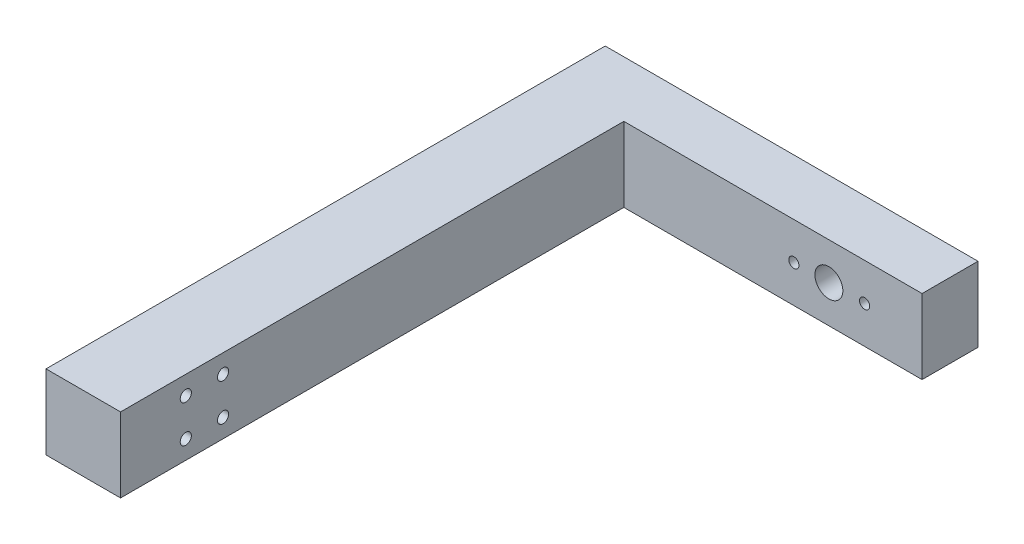
ISO-10303-21;
HEADER;
FILE_DESCRIPTION(('STEP AP214'),'2;1');
FILE_NAME('part.step','',(''),(''),'','','');
FILE_SCHEMA(('AUTOMOTIVE_DESIGN { 1 0 10303 214 1 1 1 1 }'));
ENDSEC;
DATA;
#1=APPLICATION_CONTEXT('core data for automotive mechanical design processes');
#2=APPLICATION_PROTOCOL_DEFINITION('international standard','automotive_design',2000,#1);
#3=PRODUCT_CONTEXT('',#1,'mechanical');
#4=PRODUCT('Part','Part','',(#3));
#5=PRODUCT_RELATED_PRODUCT_CATEGORY('part','',(#4));
#6=PRODUCT_DEFINITION_FORMATION('','',#4);
#7=PRODUCT_DEFINITION_CONTEXT('part definition',#1,'design');
#8=PRODUCT_DEFINITION('design','',#6,#7);
#9=PRODUCT_DEFINITION_SHAPE('','',#8);
#10=(LENGTH_UNIT() NAMED_UNIT(*) SI_UNIT(.MILLI.,.METRE.));
#11=(NAMED_UNIT(*) PLANE_ANGLE_UNIT() SI_UNIT($,.RADIAN.));
#12=(NAMED_UNIT(*) SI_UNIT($,.STERADIAN.) SOLID_ANGLE_UNIT());
#13=UNCERTAINTY_MEASURE_WITH_UNIT(LENGTH_MEASURE(1.E-05),#10,'distance_accuracy_value','');
#14=(GEOMETRIC_REPRESENTATION_CONTEXT(3) GLOBAL_UNCERTAINTY_ASSIGNED_CONTEXT((#13)) GLOBAL_UNIT_ASSIGNED_CONTEXT((#10,
#11,#12)) REPRESENTATION_CONTEXT('',''));
#15=CARTESIAN_POINT('',(0.,0.,0.));
#16=DIRECTION('',(0.,0.,1.));
#17=DIRECTION('',(1.,0.,0.));
#18=AXIS2_PLACEMENT_3D('',#15,#16,#17);
#19=CARTESIAN_POINT('',(-59.7087378640777,40.,79.6601941747573));
#20=DIRECTION('',(1.,0.,0.));
#21=DIRECTION('',(0.,0.,-1.));
#22=AXIS2_PLACEMENT_3D('',#19,#20,#21);
#23=PLANE('',#22);
#24=CARTESIAN_POINT('',(-59.7087378640777,10.,24.6601941747573));
#25=DIRECTION('',(1.,0.,0.));
#26=DIRECTION('',(0.,0.,-1.));
#27=AXIS2_PLACEMENT_3D('',#24,#25,#26);
#28=CIRCLE('',#27,3.);
#29=CARTESIAN_POINT('',(-59.7087378640777,10.,21.6601941747573));
#30=VERTEX_POINT('',#29);
#31=EDGE_CURVE('E184',#30,#30,#28,.T.);
#32=ORIENTED_EDGE('',*,*,#31,.T.);
#33=EDGE_LOOP('',(#32));
#34=FACE_BOUND('',#33,.T.);
#35=CARTESIAN_POINT('',(-59.7087378640777,10.,44.6601941747573));
#36=DIRECTION('',(1.,0.,0.));
#37=DIRECTION('',(0.,0.,-1.));
#38=AXIS2_PLACEMENT_3D('',#35,#36,#37);
#39=CIRCLE('',#38,3.);
#40=CARTESIAN_POINT('',(-59.7087378640777,10.,41.6601941747573));
#41=VERTEX_POINT('',#40);
#42=EDGE_CURVE('E188',#41,#41,#39,.T.);
#43=ORIENTED_EDGE('',*,*,#42,.T.);
#44=EDGE_LOOP('',(#43));
#45=FACE_BOUND('',#44,.T.);
#46=CARTESIAN_POINT('',(-59.7087378640777,30.,44.6601941747573));
#47=DIRECTION('',(1.,0.,0.));
#48=DIRECTION('',(0.,0.,-1.));
#49=AXIS2_PLACEMENT_3D('',#46,#47,#48);
#50=CIRCLE('',#49,3.);
#51=CARTESIAN_POINT('',(-59.7087378640777,30.,41.6601941747573));
#52=VERTEX_POINT('',#51);
#53=EDGE_CURVE('E144',#52,#52,#50,.T.);
#54=ORIENTED_EDGE('',*,*,#53,.T.);
#55=EDGE_LOOP('',(#54));
#56=FACE_BOUND('',#55,.T.);
#57=CARTESIAN_POINT('',(-59.7087378640777,30.,24.6601941747573));
#58=DIRECTION('',(1.,0.,0.));
#59=DIRECTION('',(0.,0.,-1.));
#60=AXIS2_PLACEMENT_3D('',#57,#58,#59);
#61=CIRCLE('',#60,3.);
#62=CARTESIAN_POINT('',(-59.7087378640777,30.,21.6601941747573));
#63=VERTEX_POINT('',#62);
#64=EDGE_CURVE('E136',#63,#63,#61,.T.);
#65=ORIENTED_EDGE('',*,*,#64,.T.);
#66=EDGE_LOOP('',(#65));
#67=FACE_BOUND('',#66,.T.);
#68=DIRECTION('',(0.,0.,1.));
#69=VECTOR('',#68,1.);
#70=CARTESIAN_POINT('',(-59.7087378640777,0.,79.6601941747573));
#71=LINE('',#70,#69);
#72=CARTESIAN_POINT('',(-59.7087378640777,0.,-220.339805825243));
#73=VERTEX_POINT('',#72);
#74=CARTESIAN_POINT('',(-59.7087378640777,0.,79.6601941747573));
#75=VERTEX_POINT('',#74);
#76=EDGE_CURVE('E119',#73,#75,#71,.T.);
#77=ORIENTED_EDGE('',*,*,#76,.T.);
#78=DIRECTION('',(0.,-1.,0.));
#79=VECTOR('',#78,1.);
#80=CARTESIAN_POINT('',(-59.7087378640777,40.,79.6601941747573));
#81=LINE('',#80,#79);
#82=CARTESIAN_POINT('',(-59.7087378640777,40.,79.6601941747573));
#83=VERTEX_POINT('',#82);
#84=EDGE_CURVE('E11',#83,#75,#81,.T.);
#85=ORIENTED_EDGE('',*,*,#84,.F.);
#86=DIRECTION('',(0.,0.,1.));
#87=VECTOR('',#86,1.);
#88=CARTESIAN_POINT('',(-59.7087378640777,40.,79.6601941747573));
#89=LINE('',#88,#87);
#90=CARTESIAN_POINT('',(-59.7087378640777,40.,-220.339805825243));
#91=VERTEX_POINT('',#90);
#92=EDGE_CURVE('E130',#91,#83,#89,.T.);
#93=ORIENTED_EDGE('',*,*,#92,.F.);
#94=DIRECTION('',(0.,-1.,0.));
#95=VECTOR('',#94,1.);
#96=CARTESIAN_POINT('',(-59.7087378640777,40.,-220.339805825243));
#97=LINE('',#96,#95);
#98=EDGE_CURVE('E115',#91,#73,#97,.T.);
#99=ORIENTED_EDGE('',*,*,#98,.T.);
#100=EDGE_LOOP('',(#77,#85,#93,#99));
#101=FACE_BOUND('',#100,.T.);
#102=ADVANCED_FACE('F33',(#34,#45,#56,#67,#101),#23,.F.);
#103=CARTESIAN_POINT('',(-19.7087378640777,40.,79.6601941747573));
#104=DIRECTION('',(0.,0.,-1.));
#105=DIRECTION('',(-1.,0.,0.));
#106=AXIS2_PLACEMENT_3D('',#103,#104,#105);
#107=PLANE('',#106);
#108=DIRECTION('',(1.,0.,0.));
#109=VECTOR('',#108,1.);
#110=CARTESIAN_POINT('',(-19.7087378640777,0.,79.6601941747573));
#111=LINE('',#110,#109);
#112=CARTESIAN_POINT('',(-19.7087378640777,0.,79.6601941747573));
#113=VERTEX_POINT('',#112);
#114=EDGE_CURVE('E122',#75,#113,#111,.T.);
#115=ORIENTED_EDGE('',*,*,#114,.T.);
#116=DIRECTION('',(0.,-1.,0.));
#117=VECTOR('',#116,1.);
#118=CARTESIAN_POINT('',(-19.7087378640777,40.,79.6601941747573));
#119=LINE('',#118,#117);
#120=CARTESIAN_POINT('',(-19.7087378640777,40.,79.6601941747573));
#121=VERTEX_POINT('',#120);
#122=EDGE_CURVE('E42',#121,#113,#119,.T.);
#123=ORIENTED_EDGE('',*,*,#122,.F.);
#124=DIRECTION('',(1.,0.,0.));
#125=VECTOR('',#124,1.);
#126=CARTESIAN_POINT('',(-19.7087378640777,40.,79.6601941747573));
#127=LINE('',#126,#125);
#128=EDGE_CURVE('E88',#83,#121,#127,.T.);
#129=ORIENTED_EDGE('',*,*,#128,.F.);
#130=ORIENTED_EDGE('',*,*,#84,.T.);
#131=EDGE_LOOP('',(#115,#123,#129,#130));
#132=FACE_BOUND('',#131,.T.);
#133=ADVANCED_FACE('F151',(#132),#107,.F.);
#134=CARTESIAN_POINT('',(-19.7087378640777,40.,-190.339805825243));
#135=DIRECTION('',(-1.,0.,0.));
#136=DIRECTION('',(0.,0.,1.));
#137=AXIS2_PLACEMENT_3D('',#134,#135,#136);
#138=PLANE('',#137);
#139=CARTESIAN_POINT('',(-19.7087378640777,10.,24.6601941747573));
#140=DIRECTION('',(1.,0.,0.));
#141=DIRECTION('',(0.,0.,-1.));
#142=AXIS2_PLACEMENT_3D('',#139,#140,#141);
#143=CIRCLE('',#142,3.);
#144=CARTESIAN_POINT('',(-19.7087378640777,10.,21.6601941747573));
#145=VERTEX_POINT('',#144);
#146=EDGE_CURVE('E196',#145,#145,#143,.T.);
#147=ORIENTED_EDGE('',*,*,#146,.F.);
#148=EDGE_LOOP('',(#147));
#149=FACE_BOUND('',#148,.T.);
#150=CARTESIAN_POINT('',(-19.7087378640777,10.,44.6601941747573));
#151=DIRECTION('',(1.,0.,0.));
#152=DIRECTION('',(0.,0.,-1.));
#153=AXIS2_PLACEMENT_3D('',#150,#151,#152);
#154=CIRCLE('',#153,3.);
#155=CARTESIAN_POINT('',(-19.7087378640777,10.,41.6601941747573));
#156=VERTEX_POINT('',#155);
#157=EDGE_CURVE('E192',#156,#156,#154,.T.);
#158=ORIENTED_EDGE('',*,*,#157,.F.);
#159=EDGE_LOOP('',(#158));
#160=FACE_BOUND('',#159,.T.);
#161=CARTESIAN_POINT('',(-19.7087378640777,30.,44.6601941747573));
#162=DIRECTION('',(-1.,0.,0.));
#163=DIRECTION('',(0.,0.,1.));
#164=AXIS2_PLACEMENT_3D('',#161,#162,#163);
#165=CIRCLE('',#164,3.);
#166=CARTESIAN_POINT('',(-19.7087378640777,30.,41.6601941747573));
#167=VERTEX_POINT('',#166);
#168=EDGE_CURVE('E36',#167,#167,#165,.T.);
#169=ORIENTED_EDGE('',*,*,#168,.T.);
#170=EDGE_LOOP('',(#169));
#171=FACE_BOUND('',#170,.T.);
#172=CARTESIAN_POINT('',(-19.7087378640777,30.,24.6601941747573));
#173=DIRECTION('',(-1.,0.,0.));
#174=DIRECTION('',(0.,0.,1.));
#175=AXIS2_PLACEMENT_3D('',#172,#173,#174);
#176=CIRCLE('',#175,3.);
#177=CARTESIAN_POINT('',(-19.7087378640777,30.,21.6601941747573));
#178=VERTEX_POINT('',#177);
#179=EDGE_CURVE('E123',#178,#178,#176,.T.);
#180=ORIENTED_EDGE('',*,*,#179,.T.);
#181=EDGE_LOOP('',(#180));
#182=FACE_BOUND('',#181,.T.);
#183=DIRECTION('',(0.,0.,-1.));
#184=VECTOR('',#183,1.);
#185=CARTESIAN_POINT('',(-19.7087378640777,0.,-190.339805825243));
#186=LINE('',#185,#184);
#187=CARTESIAN_POINT('',(-19.7087378640777,0.,-190.339805825243));
#188=VERTEX_POINT('',#187);
#189=EDGE_CURVE('E125',#113,#188,#186,.T.);
#190=ORIENTED_EDGE('',*,*,#189,.T.);
#191=DIRECTION('',(0.,-1.,0.));
#192=VECTOR('',#191,1.);
#193=CARTESIAN_POINT('',(-19.7087378640777,40.,-190.339805825243));
#194=LINE('',#193,#192);
#195=CARTESIAN_POINT('',(-19.7087378640777,40.,-190.339805825243));
#196=VERTEX_POINT('',#195);
#197=EDGE_CURVE('E110',#196,#188,#194,.T.);
#198=ORIENTED_EDGE('',*,*,#197,.F.);
#199=DIRECTION('',(0.,0.,-1.));
#200=VECTOR('',#199,1.);
#201=CARTESIAN_POINT('',(-19.7087378640777,40.,-190.339805825243));
#202=LINE('',#201,#200);
#203=EDGE_CURVE('E101',#121,#196,#202,.T.);
#204=ORIENTED_EDGE('',*,*,#203,.F.);
#205=ORIENTED_EDGE('',*,*,#122,.T.);
#206=EDGE_LOOP('',(#190,#198,#204,#205));
#207=FACE_BOUND('',#206,.T.);
#208=ADVANCED_FACE('F154',(#149,#160,#171,#182,#207),#138,.F.);
#209=CARTESIAN_POINT('',(140.291262135922,40.,-190.339805825243));
#210=DIRECTION('',(0.,0.,-1.));
#211=DIRECTION('',(-1.,0.,0.));
#212=AXIS2_PLACEMENT_3D('',#209,#210,#211);
#213=PLANE('',#212);
#214=CARTESIAN_POINT('',(71.4937782302294,20.,-190.339805825243));
#215=DIRECTION('',(0.,0.,-1.));
#216=DIRECTION('',(-1.,0.,0.));
#217=AXIS2_PLACEMENT_3D('',#214,#215,#216);
#218=CIRCLE('',#217,2.73577535365598);
#219=CARTESIAN_POINT('',(68.7580028765734,20.,-190.339805825243));
#220=VERTEX_POINT('',#219);
#221=EDGE_CURVE('E212',#220,#220,#218,.T.);
#222=ORIENTED_EDGE('',*,*,#221,.T.);
#223=EDGE_LOOP('',(#222));
#224=FACE_BOUND('',#223,.T.);
#225=CARTESIAN_POINT('',(109.465398349037,20.,-190.339805825243));
#226=DIRECTION('',(0.,0.,-1.));
#227=DIRECTION('',(-1.,0.,0.));
#228=AXIS2_PLACEMENT_3D('',#225,#226,#227);
#229=CIRCLE('',#228,2.73577535365598);
#230=CARTESIAN_POINT('',(106.729622995381,20.,-190.339805825243));
#231=VERTEX_POINT('',#230);
#232=EDGE_CURVE('E206',#231,#231,#229,.T.);
#233=ORIENTED_EDGE('',*,*,#232,.T.);
#234=EDGE_LOOP('',(#233));
#235=FACE_BOUND('',#234,.T.);
#236=CARTESIAN_POINT('',(90.2912621359223,20.,-190.339805825243));
#237=DIRECTION('',(0.,0.,-1.));
#238=DIRECTION('',(-1.,0.,0.));
#239=AXIS2_PLACEMENT_3D('',#236,#237,#238);
#240=CIRCLE('',#239,7.5);
#241=CARTESIAN_POINT('',(82.7912621359223,20.,-190.339805825243));
#242=VERTEX_POINT('',#241);
#243=EDGE_CURVE('E199',#242,#242,#240,.T.);
#244=ORIENTED_EDGE('',*,*,#243,.T.);
#245=EDGE_LOOP('',(#244));
#246=FACE_BOUND('',#245,.T.);
#247=DIRECTION('',(1.,0.,0.));
#248=VECTOR('',#247,1.);
#249=CARTESIAN_POINT('',(140.291262135922,0.,-190.339805825243));
#250=LINE('',#249,#248);
#251=CARTESIAN_POINT('',(140.291262135922,0.,-190.339805825243));
#252=VERTEX_POINT('',#251);
#253=EDGE_CURVE('E109',#188,#252,#250,.T.);
#254=ORIENTED_EDGE('',*,*,#253,.T.);
#255=DIRECTION('',(0.,-1.,0.));
#256=VECTOR('',#255,1.);
#257=CARTESIAN_POINT('',(140.291262135922,40.,-190.339805825243));
#258=LINE('',#257,#256);
#259=CARTESIAN_POINT('',(140.291262135922,40.,-190.339805825243));
#260=VERTEX_POINT('',#259);
#261=EDGE_CURVE('E106',#260,#252,#258,.T.);
#262=ORIENTED_EDGE('',*,*,#261,.F.);
#263=DIRECTION('',(1.,0.,0.));
#264=VECTOR('',#263,1.);
#265=CARTESIAN_POINT('',(140.291262135922,40.,-190.339805825243));
#266=LINE('',#265,#264);
#267=EDGE_CURVE('E95',#196,#260,#266,.T.);
#268=ORIENTED_EDGE('',*,*,#267,.F.);
#269=ORIENTED_EDGE('',*,*,#197,.T.);
#270=EDGE_LOOP('',(#254,#262,#268,#269));
#271=FACE_BOUND('',#270,.T.);
#272=ADVANCED_FACE('F107',(#224,#235,#246,#271),#213,.F.);
#273=CARTESIAN_POINT('',(140.291262135922,40.,-220.339805825243));
#274=DIRECTION('',(-1.,0.,0.));
#275=DIRECTION('',(0.,0.,1.));
#276=AXIS2_PLACEMENT_3D('',#273,#274,#275);
#277=PLANE('',#276);
#278=DIRECTION('',(0.,0.,-1.));
#279=VECTOR('',#278,1.);
#280=CARTESIAN_POINT('',(140.291262135922,0.,-220.339805825243));
#281=LINE('',#280,#279);
#282=CARTESIAN_POINT('',(140.291262135922,0.,-220.339805825243));
#283=VERTEX_POINT('',#282);
#284=EDGE_CURVE('E74',#252,#283,#281,.T.);
#285=ORIENTED_EDGE('',*,*,#284,.T.);
#286=DIRECTION('',(0.,-1.,0.));
#287=VECTOR('',#286,1.);
#288=CARTESIAN_POINT('',(140.291262135922,40.,-220.339805825243));
#289=LINE('',#288,#287);
#290=CARTESIAN_POINT('',(140.291262135922,40.,-220.339805825243));
#291=VERTEX_POINT('',#290);
#292=EDGE_CURVE('E111',#291,#283,#289,.T.);
#293=ORIENTED_EDGE('',*,*,#292,.F.);
#294=DIRECTION('',(0.,0.,-1.));
#295=VECTOR('',#294,1.);
#296=CARTESIAN_POINT('',(140.291262135922,40.,-220.339805825243));
#297=LINE('',#296,#295);
#298=EDGE_CURVE('E99',#260,#291,#297,.T.);
#299=ORIENTED_EDGE('',*,*,#298,.F.);
#300=ORIENTED_EDGE('',*,*,#261,.T.);
#301=EDGE_LOOP('',(#285,#293,#299,#300));
#302=FACE_BOUND('',#301,.T.);
#303=ADVANCED_FACE('F113',(#302),#277,.F.);
#304=CARTESIAN_POINT('',(-59.7087378640777,40.,-220.339805825243));
#305=DIRECTION('',(0.,0.,1.));
#306=DIRECTION('',(1.,0.,0.));
#307=AXIS2_PLACEMENT_3D('',#304,#305,#306);
#308=PLANE('',#307);
#309=CARTESIAN_POINT('',(71.4937782302294,20.,-220.339805825243));
#310=DIRECTION('',(0.,0.,-1.));
#311=DIRECTION('',(1.,0.,0.));
#312=AXIS2_PLACEMENT_3D('',#309,#310,#311);
#313=CIRCLE('',#312,2.73577535365598);
#314=CARTESIAN_POINT('',(74.2295535838854,20.,-220.339805825243));
#315=VERTEX_POINT('',#314);
#316=EDGE_CURVE('E215',#315,#315,#313,.T.);
#317=ORIENTED_EDGE('',*,*,#316,.F.);
#318=EDGE_LOOP('',(#317));
#319=FACE_BOUND('',#318,.T.);
#320=CARTESIAN_POINT('',(109.465398349037,20.,-220.339805825243));
#321=DIRECTION('',(0.,0.,-1.));
#322=DIRECTION('',(-1.,0.,0.));
#323=AXIS2_PLACEMENT_3D('',#320,#321,#322);
#324=CIRCLE('',#323,2.73577535365598);
#325=CARTESIAN_POINT('',(106.729622995381,20.,-220.339805825243));
#326=VERTEX_POINT('',#325);
#327=EDGE_CURVE('E209',#326,#326,#324,.T.);
#328=ORIENTED_EDGE('',*,*,#327,.F.);
#329=EDGE_LOOP('',(#328));
#330=FACE_BOUND('',#329,.T.);
#331=CARTESIAN_POINT('',(90.2912621359223,20.,-220.339805825243));
#332=DIRECTION('',(0.,0.,-1.));
#333=DIRECTION('',(-1.,0.,0.));
#334=AXIS2_PLACEMENT_3D('',#331,#332,#333);
#335=CIRCLE('',#334,7.5);
#336=CARTESIAN_POINT('',(82.7912621359223,20.,-220.339805825243));
#337=VERTEX_POINT('',#336);
#338=EDGE_CURVE('E203',#337,#337,#335,.T.);
#339=ORIENTED_EDGE('',*,*,#338,.F.);
#340=EDGE_LOOP('',(#339));
#341=FACE_BOUND('',#340,.T.);
#342=DIRECTION('',(-1.,0.,0.));
#343=VECTOR('',#342,1.);
#344=CARTESIAN_POINT('',(-59.7087378640777,0.,-220.339805825243));
#345=LINE('',#344,#343);
#346=EDGE_CURVE('E80',#283,#73,#345,.T.);
#347=ORIENTED_EDGE('',*,*,#346,.T.);
#348=ORIENTED_EDGE('',*,*,#98,.F.);
#349=DIRECTION('',(-1.,0.,0.));
#350=VECTOR('',#349,1.);
#351=CARTESIAN_POINT('',(-59.7087378640777,40.,-220.339805825243));
#352=LINE('',#351,#350);
#353=EDGE_CURVE('E51',#291,#91,#352,.T.);
#354=ORIENTED_EDGE('',*,*,#353,.F.);
#355=ORIENTED_EDGE('',*,*,#292,.T.);
#356=EDGE_LOOP('',(#347,#348,#354,#355));
#357=FACE_BOUND('',#356,.T.);
#358=ADVANCED_FACE('F159',(#319,#330,#341,#357),#308,.F.);
#359=CARTESIAN_POINT('',(0.,40.,0.));
#360=DIRECTION('',(0.,-1.,0.));
#361=DIRECTION('',(0.,0.,-1.));
#362=AXIS2_PLACEMENT_3D('',#359,#360,#361);
#363=PLANE('',#362);
#364=ORIENTED_EDGE('',*,*,#92,.T.);
#365=ORIENTED_EDGE('',*,*,#128,.T.);
#366=ORIENTED_EDGE('',*,*,#203,.T.);
#367=ORIENTED_EDGE('',*,*,#267,.T.);
#368=ORIENTED_EDGE('',*,*,#298,.T.);
#369=ORIENTED_EDGE('',*,*,#353,.T.);
#370=EDGE_LOOP('',(#364,#365,#366,#367,#368,#369));
#371=FACE_BOUND('',#370,.T.);
#372=ADVANCED_FACE('F97',(#371),#363,.F.);
#373=CARTESIAN_POINT('',(0.,0.,0.));
#374=DIRECTION('',(0.,-1.,0.));
#375=DIRECTION('',(0.,0.,-1.));
#376=AXIS2_PLACEMENT_3D('',#373,#374,#375);
#377=PLANE('',#376);
#378=ORIENTED_EDGE('',*,*,#76,.F.);
#379=ORIENTED_EDGE('',*,*,#346,.F.);
#380=ORIENTED_EDGE('',*,*,#284,.F.);
#381=ORIENTED_EDGE('',*,*,#253,.F.);
#382=ORIENTED_EDGE('',*,*,#189,.F.);
#383=ORIENTED_EDGE('',*,*,#114,.F.);
#384=EDGE_LOOP('',(#378,#379,#380,#381,#382,#383));
#385=FACE_BOUND('',#384,.T.);
#386=ADVANCED_FACE('F157',(#385),#377,.T.);
#387=CARTESIAN_POINT('',(-59.7087378640777,30.,24.6601941747573));
#388=DIRECTION('',(1.,0.,0.));
#389=DIRECTION('',(0.,0.,-1.));
#390=AXIS2_PLACEMENT_3D('',#387,#388,#389);
#391=CYLINDRICAL_SURFACE('',#390,3.);
#392=CARTESIAN_POINT('',(-59.7087378640777,30.,21.6601941747573));
#393=CARTESIAN_POINT('',(-59.292071197411,30.,21.6601941747573));
#394=CARTESIAN_POINT('',(-58.8754045307444,30.,21.6601941747573));
#395=CARTESIAN_POINT('',(-58.042071197411,30.,21.6601941747573));
#396=CARTESIAN_POINT('',(-57.6254045307444,30.,21.6601941747573));
#397=CARTESIAN_POINT('',(-56.792071197411,30.,21.6601941747573));
#398=CARTESIAN_POINT('',(-56.3754045307444,30.,21.6601941747573));
#399=CARTESIAN_POINT('',(-55.542071197411,30.,21.6601941747573));
#400=CARTESIAN_POINT('',(-55.1254045307444,30.,21.6601941747573));
#401=CARTESIAN_POINT('',(-54.292071197411,30.,21.6601941747573));
#402=CARTESIAN_POINT('',(-53.8754045307444,30.,21.6601941747573));
#403=CARTESIAN_POINT('',(-53.042071197411,30.,21.6601941747573));
#404=CARTESIAN_POINT('',(-52.6254045307444,30.,21.6601941747573));
#405=CARTESIAN_POINT('',(-51.792071197411,30.,21.6601941747573));
#406=CARTESIAN_POINT('',(-51.3754045307444,30.,21.6601941747573));
#407=CARTESIAN_POINT('',(-50.542071197411,30.,21.6601941747573));
#408=CARTESIAN_POINT('',(-50.1254045307444,30.,21.6601941747573));
#409=CARTESIAN_POINT('',(-49.292071197411,30.,21.6601941747573));
#410=CARTESIAN_POINT('',(-48.8754045307444,30.,21.6601941747573));
#411=CARTESIAN_POINT('',(-48.042071197411,30.,21.6601941747573));
#412=CARTESIAN_POINT('',(-47.6254045307444,30.,21.6601941747573));
#413=CARTESIAN_POINT('',(-46.792071197411,30.,21.6601941747573));
#414=CARTESIAN_POINT('',(-46.3754045307444,30.,21.6601941747573));
#415=CARTESIAN_POINT('',(-45.542071197411,30.,21.6601941747573));
#416=CARTESIAN_POINT('',(-45.1254045307444,30.,21.6601941747573));
#417=CARTESIAN_POINT('',(-44.292071197411,30.,21.6601941747573));
#418=CARTESIAN_POINT('',(-43.8754045307444,30.,21.6601941747573));
#419=CARTESIAN_POINT('',(-43.042071197411,30.,21.6601941747573));
#420=CARTESIAN_POINT('',(-42.6254045307444,30.,21.6601941747573));
#421=CARTESIAN_POINT('',(-41.792071197411,30.,21.6601941747573));
#422=CARTESIAN_POINT('',(-41.3754045307444,30.,21.6601941747573));
#423=CARTESIAN_POINT('',(-40.542071197411,30.,21.6601941747573));
#424=CARTESIAN_POINT('',(-40.1254045307444,30.,21.6601941747573));
#425=CARTESIAN_POINT('',(-39.292071197411,30.,21.6601941747573));
#426=CARTESIAN_POINT('',(-38.8754045307444,30.,21.6601941747573));
#427=CARTESIAN_POINT('',(-38.042071197411,30.,21.6601941747573));
#428=CARTESIAN_POINT('',(-37.6254045307444,30.,21.6601941747573));
#429=CARTESIAN_POINT('',(-36.792071197411,30.,21.6601941747573));
#430=CARTESIAN_POINT('',(-36.3754045307444,30.,21.6601941747573));
#431=CARTESIAN_POINT('',(-35.542071197411,30.,21.6601941747573));
#432=CARTESIAN_POINT('',(-35.1254045307444,30.,21.6601941747573));
#433=CARTESIAN_POINT('',(-34.292071197411,30.,21.6601941747573));
#434=CARTESIAN_POINT('',(-33.8754045307444,30.,21.6601941747573));
#435=CARTESIAN_POINT('',(-33.042071197411,30.,21.6601941747573));
#436=CARTESIAN_POINT('',(-32.6254045307444,30.,21.6601941747573));
#437=CARTESIAN_POINT('',(-31.792071197411,30.,21.6601941747573));
#438=CARTESIAN_POINT('',(-31.3754045307444,30.,21.6601941747573));
#439=CARTESIAN_POINT('',(-30.542071197411,30.,21.6601941747573));
#440=CARTESIAN_POINT('',(-30.1254045307444,30.,21.6601941747573));
#441=CARTESIAN_POINT('',(-29.292071197411,30.,21.6601941747573));
#442=CARTESIAN_POINT('',(-28.8754045307444,30.,21.6601941747573));
#443=CARTESIAN_POINT('',(-28.042071197411,30.,21.6601941747573));
#444=CARTESIAN_POINT('',(-27.6254045307444,30.,21.6601941747573));
#445=CARTESIAN_POINT('',(-26.792071197411,30.,21.6601941747573));
#446=CARTESIAN_POINT('',(-26.3754045307444,30.,21.6601941747573));
#447=CARTESIAN_POINT('',(-25.542071197411,30.,21.6601941747573));
#448=CARTESIAN_POINT('',(-25.1254045307444,30.,21.6601941747573));
#449=CARTESIAN_POINT('',(-24.292071197411,30.,21.6601941747573));
#450=CARTESIAN_POINT('',(-23.8754045307444,30.,21.6601941747573));
#451=CARTESIAN_POINT('',(-23.042071197411,30.,21.6601941747573));
#452=CARTESIAN_POINT('',(-22.6254045307444,30.,21.6601941747573));
#453=CARTESIAN_POINT('',(-21.792071197411,30.,21.6601941747573));
#454=CARTESIAN_POINT('',(-21.3754045307444,30.,21.6601941747573));
#455=CARTESIAN_POINT('',(-20.542071197411,30.,21.6601941747573));
#456=CARTESIAN_POINT('',(-20.1254045307444,30.,21.6601941747573));
#457=CARTESIAN_POINT('',(-19.7087378640777,30.,21.6601941747573));
#458=B_SPLINE_CURVE_WITH_KNOTS('',3,(#392,#393,#394,#395,#396,#397,#398,#399,#400,#401,#402,
#403,#404,#405,#406,#407,#408,#409,#410,#411,#412,#413,#414,#415,#416,#417,#418,#419,#420,#421,
#422,#423,#424,#425,#426,#427,#428,#429,#430,#431,#432,#433,#434,#435,#436,#437,#438,#439,#440,
#441,#442,#443,#444,#445,#446,#447,#448,#449,#450,#451,#452,#453,#454,#455,#456,#457),
.UNSPECIFIED.,.F.,.F.,(4,2,2,2,2,2,2,2,2,2,2,2,2,2,2,2,2,2,2,2,2,2,2,2,2,2,2,2,2,2,2,2,4),(0.,
1.25,2.5,3.75,5.,6.25000000000001,7.5,8.75,10.,11.25,12.5,13.75,15.,16.25,17.5,18.75,20.,21.25,
22.5,23.75,25.,26.25,27.5,28.75,30.,31.25,32.5,33.75,35.,36.25,37.5,38.75,40.),.UNSPECIFIED.);
#459=EDGE_CURVE('BSEAM252',#63,#178,#458,.T.);
#460=ORIENTED_EDGE('',*,*,#64,.F.);
#461=ORIENTED_EDGE('',*,*,#179,.F.);
#462=ORIENTED_EDGE('',*,*,#459,.T.);
#463=ORIENTED_EDGE('',*,*,#459,.F.);
#464=EDGE_LOOP('',(#460,#462,#461,#463));
#465=FACE_BOUND('',#464,.T.);
#466=ADVANCED_FACE('F252',(#465),#391,.F.);
#467=CARTESIAN_POINT('',(-59.7087378640777,30.,44.6601941747573));
#468=DIRECTION('',(1.,0.,0.));
#469=DIRECTION('',(0.,0.,-1.));
#470=AXIS2_PLACEMENT_3D('',#467,#468,#469);
#471=CYLINDRICAL_SURFACE('',#470,3.);
#472=CARTESIAN_POINT('',(-59.7087378640777,30.,41.6601941747573));
#473=CARTESIAN_POINT('',(-59.292071197411,30.,41.6601941747573));
#474=CARTESIAN_POINT('',(-58.8754045307444,30.,41.6601941747573));
#475=CARTESIAN_POINT('',(-58.042071197411,30.,41.6601941747573));
#476=CARTESIAN_POINT('',(-57.6254045307444,30.,41.6601941747573));
#477=CARTESIAN_POINT('',(-56.792071197411,30.,41.6601941747573));
#478=CARTESIAN_POINT('',(-56.3754045307444,30.,41.6601941747573));
#479=CARTESIAN_POINT('',(-55.542071197411,30.,41.6601941747573));
#480=CARTESIAN_POINT('',(-55.1254045307444,30.,41.6601941747573));
#481=CARTESIAN_POINT('',(-54.292071197411,30.,41.6601941747573));
#482=CARTESIAN_POINT('',(-53.8754045307444,30.,41.6601941747573));
#483=CARTESIAN_POINT('',(-53.042071197411,30.,41.6601941747573));
#484=CARTESIAN_POINT('',(-52.6254045307444,30.,41.6601941747573));
#485=CARTESIAN_POINT('',(-51.792071197411,30.,41.6601941747573));
#486=CARTESIAN_POINT('',(-51.3754045307444,30.,41.6601941747573));
#487=CARTESIAN_POINT('',(-50.542071197411,30.,41.6601941747573));
#488=CARTESIAN_POINT('',(-50.1254045307444,30.,41.6601941747573));
#489=CARTESIAN_POINT('',(-49.292071197411,30.,41.6601941747573));
#490=CARTESIAN_POINT('',(-48.8754045307444,30.,41.6601941747573));
#491=CARTESIAN_POINT('',(-48.042071197411,30.,41.6601941747573));
#492=CARTESIAN_POINT('',(-47.6254045307444,30.,41.6601941747573));
#493=CARTESIAN_POINT('',(-46.792071197411,30.,41.6601941747573));
#494=CARTESIAN_POINT('',(-46.3754045307444,30.,41.6601941747573));
#495=CARTESIAN_POINT('',(-45.542071197411,30.,41.6601941747573));
#496=CARTESIAN_POINT('',(-45.1254045307444,30.,41.6601941747573));
#497=CARTESIAN_POINT('',(-44.292071197411,30.,41.6601941747573));
#498=CARTESIAN_POINT('',(-43.8754045307444,30.,41.6601941747573));
#499=CARTESIAN_POINT('',(-43.042071197411,30.,41.6601941747573));
#500=CARTESIAN_POINT('',(-42.6254045307444,30.,41.6601941747573));
#501=CARTESIAN_POINT('',(-41.792071197411,30.,41.6601941747573));
#502=CARTESIAN_POINT('',(-41.3754045307444,30.,41.6601941747573));
#503=CARTESIAN_POINT('',(-40.542071197411,30.,41.6601941747573));
#504=CARTESIAN_POINT('',(-40.1254045307444,30.,41.6601941747573));
#505=CARTESIAN_POINT('',(-39.292071197411,30.,41.6601941747573));
#506=CARTESIAN_POINT('',(-38.8754045307444,30.,41.6601941747573));
#507=CARTESIAN_POINT('',(-38.042071197411,30.,41.6601941747573));
#508=CARTESIAN_POINT('',(-37.6254045307444,30.,41.6601941747573));
#509=CARTESIAN_POINT('',(-36.792071197411,30.,41.6601941747573));
#510=CARTESIAN_POINT('',(-36.3754045307444,30.,41.6601941747573));
#511=CARTESIAN_POINT('',(-35.542071197411,30.,41.6601941747573));
#512=CARTESIAN_POINT('',(-35.1254045307444,30.,41.6601941747573));
#513=CARTESIAN_POINT('',(-34.292071197411,30.,41.6601941747573));
#514=CARTESIAN_POINT('',(-33.8754045307444,30.,41.6601941747573));
#515=CARTESIAN_POINT('',(-33.042071197411,30.,41.6601941747573));
#516=CARTESIAN_POINT('',(-32.6254045307444,30.,41.6601941747573));
#517=CARTESIAN_POINT('',(-31.792071197411,30.,41.6601941747573));
#518=CARTESIAN_POINT('',(-31.3754045307444,30.,41.6601941747573));
#519=CARTESIAN_POINT('',(-30.542071197411,30.,41.6601941747573));
#520=CARTESIAN_POINT('',(-30.1254045307444,30.,41.6601941747573));
#521=CARTESIAN_POINT('',(-29.292071197411,30.,41.6601941747573));
#522=CARTESIAN_POINT('',(-28.8754045307444,30.,41.6601941747573));
#523=CARTESIAN_POINT('',(-28.042071197411,30.,41.6601941747573));
#524=CARTESIAN_POINT('',(-27.6254045307444,30.,41.6601941747573));
#525=CARTESIAN_POINT('',(-26.792071197411,30.,41.6601941747573));
#526=CARTESIAN_POINT('',(-26.3754045307444,30.,41.6601941747573));
#527=CARTESIAN_POINT('',(-25.542071197411,30.,41.6601941747573));
#528=CARTESIAN_POINT('',(-25.1254045307444,30.,41.6601941747573));
#529=CARTESIAN_POINT('',(-24.292071197411,30.,41.6601941747573));
#530=CARTESIAN_POINT('',(-23.8754045307444,30.,41.6601941747573));
#531=CARTESIAN_POINT('',(-23.042071197411,30.,41.6601941747573));
#532=CARTESIAN_POINT('',(-22.6254045307444,30.,41.6601941747573));
#533=CARTESIAN_POINT('',(-21.792071197411,30.,41.6601941747573));
#534=CARTESIAN_POINT('',(-21.3754045307444,30.,41.6601941747573));
#535=CARTESIAN_POINT('',(-20.542071197411,30.,41.6601941747573));
#536=CARTESIAN_POINT('',(-20.1254045307444,30.,41.6601941747573));
#537=CARTESIAN_POINT('',(-19.7087378640777,30.,41.6601941747573));
#538=B_SPLINE_CURVE_WITH_KNOTS('',3,(#472,#473,#474,#475,#476,#477,#478,#479,#480,#481,#482,
#483,#484,#485,#486,#487,#488,#489,#490,#491,#492,#493,#494,#495,#496,#497,#498,#499,#500,#501,
#502,#503,#504,#505,#506,#507,#508,#509,#510,#511,#512,#513,#514,#515,#516,#517,#518,#519,#520,
#521,#522,#523,#524,#525,#526,#527,#528,#529,#530,#531,#532,#533,#534,#535,#536,#537),
.UNSPECIFIED.,.F.,.F.,(4,2,2,2,2,2,2,2,2,2,2,2,2,2,2,2,2,2,2,2,2,2,2,2,2,2,2,2,2,2,2,2,4),(0.,
1.25,2.5,3.75,5.,6.25000000000001,7.5,8.75,10.,11.25,12.5,13.75,15.,16.25,17.5,18.75,20.,21.25,
22.5,23.75,25.,26.25,27.5,28.75,30.,31.25,32.5,33.75,35.,36.25,37.5,38.75,40.),.UNSPECIFIED.);
#539=EDGE_CURVE('BSEAM248',#52,#167,#538,.T.);
#540=ORIENTED_EDGE('',*,*,#53,.F.);
#541=ORIENTED_EDGE('',*,*,#168,.F.);
#542=ORIENTED_EDGE('',*,*,#539,.T.);
#543=ORIENTED_EDGE('',*,*,#539,.F.);
#544=EDGE_LOOP('',(#540,#542,#541,#543));
#545=FACE_BOUND('',#544,.T.);
#546=ADVANCED_FACE('F248',(#545),#471,.F.);
#547=CARTESIAN_POINT('',(-59.7087378640777,10.,44.6601941747573));
#548=DIRECTION('',(1.,0.,0.));
#549=DIRECTION('',(0.,0.,-1.));
#550=AXIS2_PLACEMENT_3D('',#547,#548,#549);
#551=CYLINDRICAL_SURFACE('',#550,3.);
#552=ORIENTED_EDGE('',*,*,#42,.F.);
#553=EDGE_LOOP('',(#552));
#554=FACE_BOUND('',#553,.T.);
#555=ORIENTED_EDGE('',*,*,#157,.T.);
#556=EDGE_LOOP('',(#555));
#557=FACE_BOUND('',#556,.T.);
#558=ADVANCED_FACE('F242',(#554,#557),#551,.F.);
#559=CARTESIAN_POINT('',(-59.7087378640777,10.,24.6601941747573));
#560=DIRECTION('',(1.,0.,0.));
#561=DIRECTION('',(0.,0.,-1.));
#562=AXIS2_PLACEMENT_3D('',#559,#560,#561);
#563=CYLINDRICAL_SURFACE('',#562,3.);
#564=ORIENTED_EDGE('',*,*,#31,.F.);
#565=EDGE_LOOP('',(#564));
#566=FACE_BOUND('',#565,.T.);
#567=ORIENTED_EDGE('',*,*,#146,.T.);
#568=EDGE_LOOP('',(#567));
#569=FACE_BOUND('',#568,.T.);
#570=ADVANCED_FACE('F233',(#566,#569),#563,.F.);
#571=CARTESIAN_POINT('',(90.2912621359223,20.,-180.339805825243));
#572=DIRECTION('',(0.,0.,-1.));
#573=DIRECTION('',(-1.,0.,0.));
#574=AXIS2_PLACEMENT_3D('',#571,#572,#573);
#575=CYLINDRICAL_SURFACE('',#574,7.5);
#576=ORIENTED_EDGE('',*,*,#338,.T.);
#577=EDGE_LOOP('',(#576));
#578=FACE_BOUND('',#577,.T.);
#579=ORIENTED_EDGE('',*,*,#243,.F.);
#580=EDGE_LOOP('',(#579));
#581=FACE_BOUND('',#580,.T.);
#582=ADVANCED_FACE('F231',(#578,#581),#575,.F.);
#583=CARTESIAN_POINT('',(109.465398349037,20.,-180.339805825243));
#584=DIRECTION('',(0.,0.,-1.));
#585=DIRECTION('',(-1.,0.,0.));
#586=AXIS2_PLACEMENT_3D('',#583,#584,#585);
#587=CYLINDRICAL_SURFACE('',#586,2.73577535365598);
#588=ORIENTED_EDGE('',*,*,#327,.T.);
#589=EDGE_LOOP('',(#588));
#590=FACE_BOUND('',#589,.T.);
#591=ORIENTED_EDGE('',*,*,#232,.F.);
#592=EDGE_LOOP('',(#591));
#593=FACE_BOUND('',#592,.T.);
#594=ADVANCED_FACE('F221',(#590,#593),#587,.F.);
#595=CARTESIAN_POINT('',(71.4937782302294,20.,-180.339805825243));
#596=DIRECTION('',(0.,0.,-1.));
#597=DIRECTION('',(-1.,0.,0.));
#598=AXIS2_PLACEMENT_3D('',#595,#596,#597);
#599=CYLINDRICAL_SURFACE('',#598,2.73577535365598);
#600=ORIENTED_EDGE('',*,*,#316,.T.);
#601=EDGE_LOOP('',(#600));
#602=FACE_BOUND('',#601,.T.);
#603=ORIENTED_EDGE('',*,*,#221,.F.);
#604=EDGE_LOOP('',(#603));
#605=FACE_BOUND('',#604,.T.);
#606=ADVANCED_FACE('F218',(#602,#605),#599,.F.);
#607=CLOSED_SHELL('',(#102,#133,#208,#272,#303,#358,#372,#386,#466,#546,#558,#570,#582,#594,#606));
#608=MANIFOLD_SOLID_BREP('B2',#607);
#609=ADVANCED_BREP_SHAPE_REPRESENTATION('',(#18,#608),#14);
#610=SHAPE_DEFINITION_REPRESENTATION(#9,#609);
ENDSEC;
END-ISO-10303-21;
